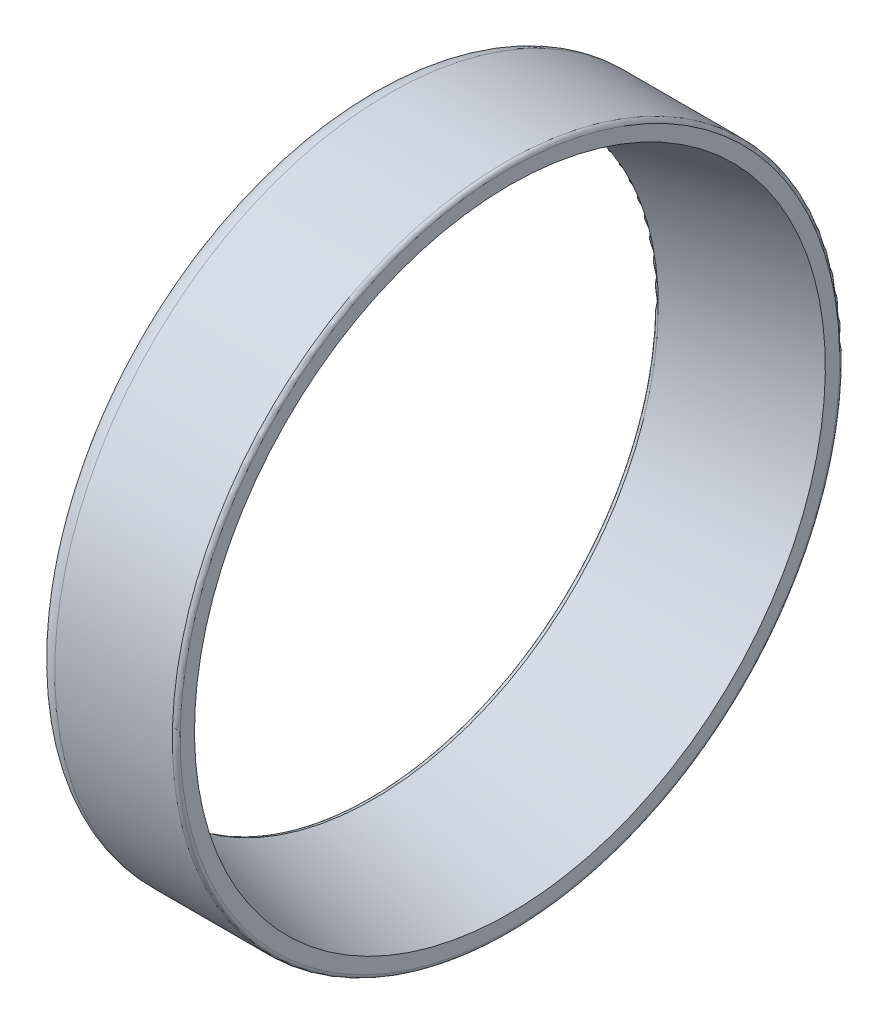
ISO-10303-21;
HEADER;
FILE_DESCRIPTION(('STEP AP214'),'2;1');
FILE_NAME('part.step','',(''),(''),'','','');
FILE_SCHEMA(('AUTOMOTIVE_DESIGN { 1 0 10303 214 1 1 1 1 }'));
ENDSEC;
DATA;
#1=APPLICATION_CONTEXT('core data for automotive mechanical design processes');
#2=APPLICATION_PROTOCOL_DEFINITION('international standard','automotive_design',2000,#1);
#3=PRODUCT_CONTEXT('',#1,'mechanical');
#4=PRODUCT('Part','Part','',(#3));
#5=PRODUCT_RELATED_PRODUCT_CATEGORY('part','',(#4));
#6=PRODUCT_DEFINITION_FORMATION('','',#4);
#7=PRODUCT_DEFINITION_CONTEXT('part definition',#1,'design');
#8=PRODUCT_DEFINITION('design','',#6,#7);
#9=PRODUCT_DEFINITION_SHAPE('','',#8);
#10=(LENGTH_UNIT() NAMED_UNIT(*) SI_UNIT(.MILLI.,.METRE.));
#11=(NAMED_UNIT(*) PLANE_ANGLE_UNIT() SI_UNIT($,.RADIAN.));
#12=(NAMED_UNIT(*) SI_UNIT($,.STERADIAN.) SOLID_ANGLE_UNIT());
#13=UNCERTAINTY_MEASURE_WITH_UNIT(LENGTH_MEASURE(1.E-05),#10,'distance_accuracy_value','');
#14=(GEOMETRIC_REPRESENTATION_CONTEXT(3) GLOBAL_UNCERTAINTY_ASSIGNED_CONTEXT((#13)) GLOBAL_UNIT_ASSIGNED_CONTEXT((#10,
#11,#12)) REPRESENTATION_CONTEXT('',''));
#15=CARTESIAN_POINT('',(0.,0.,0.));
#16=DIRECTION('',(0.,0.,1.));
#17=DIRECTION('',(1.,0.,0.));
#18=AXIS2_PLACEMENT_3D('',#15,#16,#17);
#19=CARTESIAN_POINT('',(0.66,0.,0.));
#20=DIRECTION('',(1.,0.,0.));
#21=DIRECTION('',(0.,0.,-1.));
#22=AXIS2_PLACEMENT_3D('',#19,#20,#21);
#23=TOROIDAL_SURFACE('',#22,48.7108312221326,0.66);
#24=CARTESIAN_POINT('',(0.80566030711419,0.,0.));
#25=DIRECTION('',(1.,0.,0.));
#26=DIRECTION('',(0.,1.,0.));
#27=AXIS2_PLACEMENT_3D('',#24,#25,#26);
#28=CIRCLE('',#27,48.067105290597);
#29=CARTESIAN_POINT('',(0.80566030711419,48.067105290597,0.));
#30=VERTEX_POINT('',#29);
#31=EDGE_CURVE('E11',#30,#30,#28,.T.);
#32=ORIENTED_EDGE('',*,*,#31,.T.);
#33=EDGE_LOOP('',(#32));
#34=FACE_BOUND('',#33,.T.);
#35=CARTESIAN_POINT('',(0.,0.,0.));
#36=DIRECTION('',(1.,0.,0.));
#37=DIRECTION('',(0.,1.,0.));
#38=AXIS2_PLACEMENT_3D('',#35,#36,#37);
#39=CIRCLE('',#38,48.7108312221326);
#40=CARTESIAN_POINT('',(0.,48.7108312221326,0.));
#41=VERTEX_POINT('',#40);
#42=EDGE_CURVE('E54',#41,#41,#39,.T.);
#43=ORIENTED_EDGE('',*,*,#42,.F.);
#44=EDGE_LOOP('',(#43));
#45=FACE_BOUND('',#44,.T.);
#46=ADVANCED_FACE('F17',(#34,#45),#23,.T.);
#47=CARTESIAN_POINT('',(12.3088301535571,0.,0.));
#48=DIRECTION('',(1.,0.,0.));
#49=DIRECTION('',(0.,1.,0.));
#50=AXIS2_PLACEMENT_3D('',#47,#48,#49);
#51=CONICAL_SURFACE('',#50,50.6700068835506,0.222529479629277);
#52=CARTESIAN_POINT('',(23.812,0.,0.));
#53=DIRECTION('',(1.,0.,0.));
#54=DIRECTION('',(0.,1.,0.));
#55=AXIS2_PLACEMENT_3D('',#52,#53,#54);
#56=CIRCLE('',#55,53.2729084765041);
#57=CARTESIAN_POINT('',(23.812,53.2729084765041,0.));
#58=VERTEX_POINT('',#57);
#59=EDGE_CURVE('E27',#58,#58,#56,.T.);
#60=ORIENTED_EDGE('',*,*,#59,.T.);
#61=EDGE_LOOP('',(#60));
#62=FACE_BOUND('',#61,.T.);
#63=ORIENTED_EDGE('',*,*,#31,.F.);
#64=EDGE_LOOP('',(#63));
#65=FACE_BOUND('',#64,.T.);
#66=ADVANCED_FACE('F66',(#62,#65),#51,.F.);
#67=CARTESIAN_POINT('',(23.812,54.4844542382521,0.));
#68=DIRECTION('',(1.,0.,0.));
#69=DIRECTION('',(0.,1.,0.));
#70=AXIS2_PLACEMENT_3D('',#67,#68,#69);
#71=PLANE('',#70);
#72=CARTESIAN_POINT('',(23.812,0.,0.));
#73=DIRECTION('',(1.,0.,0.));
#74=DIRECTION('',(0.,1.,0.));
#75=AXIS2_PLACEMENT_3D('',#72,#73,#74);
#76=CIRCLE('',#75,55.696);
#77=CARTESIAN_POINT('',(23.812,55.696,0.));
#78=VERTEX_POINT('',#77);
#79=EDGE_CURVE('E63',#78,#78,#76,.T.);
#80=ORIENTED_EDGE('',*,*,#79,.T.);
#81=EDGE_LOOP('',(#80));
#82=FACE_BOUND('',#81,.T.);
#83=ORIENTED_EDGE('',*,*,#59,.F.);
#84=EDGE_LOOP('',(#83));
#85=FACE_BOUND('',#84,.T.);
#86=ADVANCED_FACE('F69',(#82,#85),#71,.T.);
#87=CARTESIAN_POINT('',(23.152,0.,0.));
#88=DIRECTION('',(1.,0.,0.));
#89=DIRECTION('',(0.,0.,-1.));
#90=AXIS2_PLACEMENT_3D('',#87,#88,#89);
#91=TOROIDAL_SURFACE('',#90,55.696,0.66);
#92=CARTESIAN_POINT('',(23.152,0.,0.));
#93=DIRECTION('',(1.,0.,0.));
#94=DIRECTION('',(0.,1.,0.));
#95=AXIS2_PLACEMENT_3D('',#92,#93,#94);
#96=CIRCLE('',#95,56.356);
#97=CARTESIAN_POINT('',(23.152,56.356,0.));
#98=VERTEX_POINT('',#97);
#99=EDGE_CURVE('E47',#98,#98,#96,.T.);
#100=ORIENTED_EDGE('',*,*,#99,.T.);
#101=EDGE_LOOP('',(#100));
#102=FACE_BOUND('',#101,.T.);
#103=ORIENTED_EDGE('',*,*,#79,.F.);
#104=EDGE_LOOP('',(#103));
#105=FACE_BOUND('',#104,.T.);
#106=ADVANCED_FACE('F19',(#102,#105),#91,.T.);
#107=CARTESIAN_POINT('',(13.226,0.,0.));
#108=DIRECTION('',(-1.,0.,0.));
#109=DIRECTION('',(0.,1.,0.));
#110=AXIS2_PLACEMENT_3D('',#107,#108,#109);
#111=CYLINDRICAL_SURFACE('',#110,56.356);
#112=CARTESIAN_POINT('',(3.3,0.,0.));
#113=DIRECTION('',(1.,0.,0.));
#114=DIRECTION('',(0.,1.,0.));
#115=AXIS2_PLACEMENT_3D('',#112,#113,#114);
#116=CIRCLE('',#115,56.356);
#117=CARTESIAN_POINT('',(3.3,56.356,0.));
#118=VERTEX_POINT('',#117);
#119=EDGE_CURVE('E21',#118,#118,#116,.T.);
#120=ORIENTED_EDGE('',*,*,#119,.T.);
#121=EDGE_LOOP('',(#120));
#122=FACE_BOUND('',#121,.T.);
#123=ORIENTED_EDGE('',*,*,#99,.F.);
#124=EDGE_LOOP('',(#123));
#125=FACE_BOUND('',#124,.T.);
#126=ADVANCED_FACE('F78',(#122,#125),#111,.T.);
#127=CARTESIAN_POINT('',(3.3,0.,0.));
#128=DIRECTION('',(1.,0.,0.));
#129=DIRECTION('',(0.,0.,-1.));
#130=AXIS2_PLACEMENT_3D('',#127,#128,#129);
#131=TOROIDAL_SURFACE('',#130,53.056,3.3);
#132=CARTESIAN_POINT('',(0.,0.,0.));
#133=DIRECTION('',(1.,0.,0.));
#134=DIRECTION('',(0.,1.,0.));
#135=AXIS2_PLACEMENT_3D('',#132,#133,#134);
#136=CIRCLE('',#135,53.056);
#137=CARTESIAN_POINT('',(0.,53.056,0.));
#138=VERTEX_POINT('',#137);
#139=EDGE_CURVE('E58',#138,#138,#136,.T.);
#140=ORIENTED_EDGE('',*,*,#139,.T.);
#141=EDGE_LOOP('',(#140));
#142=FACE_BOUND('',#141,.T.);
#143=ORIENTED_EDGE('',*,*,#119,.F.);
#144=EDGE_LOOP('',(#143));
#145=FACE_BOUND('',#144,.T.);
#146=ADVANCED_FACE('F86',(#142,#145),#131,.T.);
#147=CARTESIAN_POINT('',(0.,50.8834156110663,0.));
#148=DIRECTION('',(-1.,0.,0.));
#149=DIRECTION('',(0.,-1.,0.));
#150=AXIS2_PLACEMENT_3D('',#147,#148,#149);
#151=PLANE('',#150);
#152=ORIENTED_EDGE('',*,*,#42,.T.);
#153=EDGE_LOOP('',(#152));
#154=FACE_BOUND('',#153,.T.);
#155=ORIENTED_EDGE('',*,*,#139,.F.);
#156=EDGE_LOOP('',(#155));
#157=FACE_BOUND('',#156,.T.);
#158=ADVANCED_FACE('F55',(#154,#157),#151,.T.);
#159=CLOSED_SHELL('',(#46,#66,#86,#106,#126,#146,#158));
#160=MANIFOLD_SOLID_BREP('B1',#159);
#161=ADVANCED_BREP_SHAPE_REPRESENTATION('',(#18,#160),#14);
#162=SHAPE_DEFINITION_REPRESENTATION(#9,#161);
ENDSEC;
END-ISO-10303-21;
